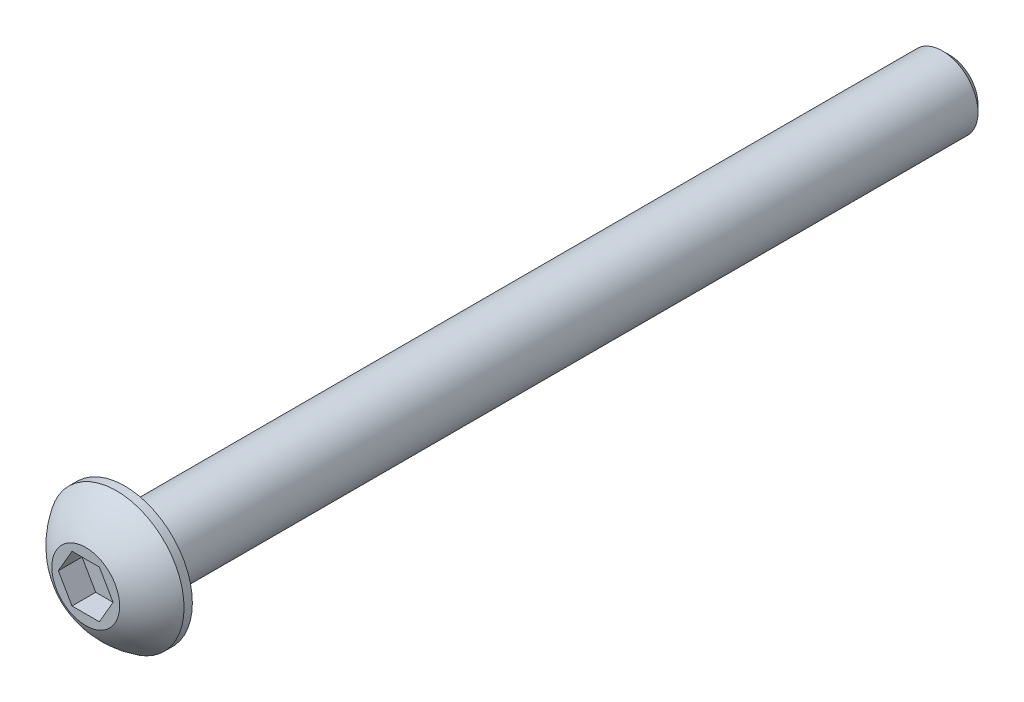
ISO-10303-21;
HEADER;
FILE_DESCRIPTION(('STEP AP214'),'2;1');
FILE_NAME('part.step','',(''),(''),'','','');
FILE_SCHEMA(('AUTOMOTIVE_DESIGN { 1 0 10303 214 1 1 1 1 }'));
ENDSEC;
DATA;
#1=APPLICATION_CONTEXT('core data for automotive mechanical design processes');
#2=APPLICATION_PROTOCOL_DEFINITION('international standard','automotive_design',2000,#1);
#3=PRODUCT_CONTEXT('',#1,'mechanical');
#4=PRODUCT('Part','Part','',(#3));
#5=PRODUCT_RELATED_PRODUCT_CATEGORY('part','',(#4));
#6=PRODUCT_DEFINITION_FORMATION('','',#4);
#7=PRODUCT_DEFINITION_CONTEXT('part definition',#1,'design');
#8=PRODUCT_DEFINITION('design','',#6,#7);
#9=PRODUCT_DEFINITION_SHAPE('','',#8);
#10=(LENGTH_UNIT() NAMED_UNIT(*) SI_UNIT(.MILLI.,.METRE.));
#11=(NAMED_UNIT(*) PLANE_ANGLE_UNIT() SI_UNIT($,.RADIAN.));
#12=(NAMED_UNIT(*) SI_UNIT($,.STERADIAN.) SOLID_ANGLE_UNIT());
#13=UNCERTAINTY_MEASURE_WITH_UNIT(LENGTH_MEASURE(1.E-05),#10,'distance_accuracy_value','');
#14=(GEOMETRIC_REPRESENTATION_CONTEXT(3) GLOBAL_UNCERTAINTY_ASSIGNED_CONTEXT((#13)) GLOBAL_UNIT_ASSIGNED_CONTEXT((#10,
#11,#12)) REPRESENTATION_CONTEXT('',''));
#15=CARTESIAN_POINT('',(0.,0.,0.));
#16=DIRECTION('',(0.,0.,1.));
#17=DIRECTION('',(1.,0.,0.));
#18=AXIS2_PLACEMENT_3D('',#15,#16,#17);
#19=CARTESIAN_POINT('',(0.,0.,-34.8));
#20=DIRECTION('',(0.,0.,1.));
#21=DIRECTION('',(1.,0.,0.));
#22=AXIS2_PLACEMENT_3D('',#19,#20,#21);
#23=PLANE('',#22);
#24=CARTESIAN_POINT('',(0.,0.,-34.8));
#25=DIRECTION('',(0.,0.,1.));
#26=DIRECTION('',(1.,0.,0.));
#27=AXIS2_PLACEMENT_3D('',#24,#25,#26);
#28=CIRCLE('',#27,1.20000000000001);
#29=CARTESIAN_POINT('',(1.20000000000001,0.,-34.8));
#30=VERTEX_POINT('',#29);
#31=EDGE_CURVE('E11',#30,#30,#28,.F.);
#32=ORIENTED_EDGE('',*,*,#31,.T.);
#33=EDGE_LOOP('',(#32));
#34=FACE_BOUND('',#33,.T.);
#35=ADVANCED_FACE('F46',(#34),#23,.F.);
#36=CARTESIAN_POINT('',(0.,0.,1.65));
#37=DIRECTION('',(0.,0.,-1.));
#38=DIRECTION('',(-1.,0.,0.));
#39=AXIS2_PLACEMENT_3D('',#36,#37,#38);
#40=PLANE('',#39);
#41=DIRECTION('',(-0.5,-0.866025403784439,0.));
#42=VECTOR('',#41,1.);
#43=CARTESIAN_POINT('',(-0.577350269189626,1.,1.65));
#44=LINE('',#43,#42);
#45=CARTESIAN_POINT('',(-0.577350269189626,1.,1.65));
#46=VERTEX_POINT('',#45);
#47=CARTESIAN_POINT('',(-1.15470053837925,0.,1.65));
#48=VERTEX_POINT('',#47);
#49=EDGE_CURVE('E136',#46,#48,#44,.T.);
#50=ORIENTED_EDGE('',*,*,#49,.F.);
#51=DIRECTION('',(-1.,0.,0.));
#52=VECTOR('',#51,1.);
#53=CARTESIAN_POINT('',(0.577350269189626,1.,1.65));
#54=LINE('',#53,#52);
#55=CARTESIAN_POINT('',(0.577350269189626,1.,1.65));
#56=VERTEX_POINT('',#55);
#57=EDGE_CURVE('E62',#56,#46,#54,.T.);
#58=ORIENTED_EDGE('',*,*,#57,.F.);
#59=DIRECTION('',(-0.5,0.866025403784438,0.));
#60=VECTOR('',#59,1.);
#61=CARTESIAN_POINT('',(1.15470053837925,0.,1.65));
#62=LINE('',#61,#60);
#63=CARTESIAN_POINT('',(1.15470053837925,0.,1.65));
#64=VERTEX_POINT('',#63);
#65=EDGE_CURVE('E145',#64,#56,#62,.T.);
#66=ORIENTED_EDGE('',*,*,#65,.F.);
#67=DIRECTION('',(0.5,0.866025403784439,0.));
#68=VECTOR('',#67,1.);
#69=CARTESIAN_POINT('',(0.577350269189626,-1.,1.65));
#70=LINE('',#69,#68);
#71=CARTESIAN_POINT('',(0.577350269189626,-1.,1.65));
#72=VERTEX_POINT('',#71);
#73=EDGE_CURVE('E143',#72,#64,#70,.T.);
#74=ORIENTED_EDGE('',*,*,#73,.F.);
#75=DIRECTION('',(1.,0.,0.));
#76=VECTOR('',#75,1.);
#77=CARTESIAN_POINT('',(-0.577350269189625,-1.,1.65));
#78=LINE('',#77,#76);
#79=CARTESIAN_POINT('',(-0.577350269189625,-1.,1.65));
#80=VERTEX_POINT('',#79);
#81=EDGE_CURVE('E110',#80,#72,#78,.T.);
#82=ORIENTED_EDGE('',*,*,#81,.F.);
#83=DIRECTION('',(0.5,-0.866025403784438,0.));
#84=VECTOR('',#83,1.);
#85=CARTESIAN_POINT('',(-1.15470053837925,0.,1.65));
#86=LINE('',#85,#84);
#87=EDGE_CURVE('E139',#48,#80,#86,.T.);
#88=ORIENTED_EDGE('',*,*,#87,.F.);
#89=EDGE_LOOP('',(#50,#58,#66,#74,#82,#88));
#90=FACE_BOUND('',#89,.T.);
#91=CARTESIAN_POINT('',(0.,0.,1.65));
#92=DIRECTION('',(0.,0.,1.));
#93=DIRECTION('',(1.,0.,0.));
#94=AXIS2_PLACEMENT_3D('',#91,#92,#93);
#95=CIRCLE('',#94,1.43);
#96=CARTESIAN_POINT('',(1.43,0.,1.65));
#97=VERTEX_POINT('',#96);
#98=EDGE_CURVE('E163',#97,#97,#95,.T.);
#99=ORIENTED_EDGE('',*,*,#98,.T.);
#100=EDGE_LOOP('',(#99));
#101=FACE_BOUND('',#100,.T.);
#102=ADVANCED_FACE('F180',(#90,#101),#40,.F.);
#103=CARTESIAN_POINT('',(0.,0.,-1.52032985611787));
#104=DIRECTION('',(0.,0.,1.));
#105=DIRECTION('',(1.,0.,0.));
#106=AXIS2_PLACEMENT_3D('',#103,#104,#105);
#107=DEGENERATE_TOROIDAL_SURFACE('',#106,0.167344234474104,3.55,.F.);
#108=ORIENTED_EDGE('',*,*,#98,.F.);
#109=EDGE_LOOP('',(#108));
#110=FACE_BOUND('',#109,.T.);
#111=CARTESIAN_POINT('',(0.,0.,0.35));
#112=DIRECTION('',(0.,0.,1.));
#113=DIRECTION('',(1.,0.,0.));
#114=AXIS2_PLACEMENT_3D('',#111,#112,#113);
#115=CIRCLE('',#114,2.85);
#116=CARTESIAN_POINT('',(2.85,0.,0.35));
#117=VERTEX_POINT('',#116);
#118=EDGE_CURVE('E160',#117,#117,#115,.T.);
#119=ORIENTED_EDGE('',*,*,#118,.T.);
#120=EDGE_LOOP('',(#119));
#121=FACE_BOUND('',#120,.T.);
#122=ADVANCED_FACE('F185',(#110,#121),#107,.F.);
#123=CARTESIAN_POINT('',(0.,0.,0.));
#124=DIRECTION('',(0.,0.,1.));
#125=DIRECTION('',(1.,0.,0.));
#126=AXIS2_PLACEMENT_3D('',#123,#124,#125);
#127=CYLINDRICAL_SURFACE('',#126,2.85);
#128=ORIENTED_EDGE('',*,*,#118,.F.);
#129=EDGE_LOOP('',(#128));
#130=FACE_BOUND('',#129,.T.);
#131=CARTESIAN_POINT('',(0.,0.,0.));
#132=DIRECTION('',(0.,0.,1.));
#133=DIRECTION('',(1.,0.,0.));
#134=AXIS2_PLACEMENT_3D('',#131,#132,#133);
#135=CIRCLE('',#134,2.85);
#136=CARTESIAN_POINT('',(2.85,0.,0.));
#137=VERTEX_POINT('',#136);
#138=EDGE_CURVE('E157',#137,#137,#135,.T.);
#139=ORIENTED_EDGE('',*,*,#138,.T.);
#140=EDGE_LOOP('',(#139));
#141=FACE_BOUND('',#140,.T.);
#142=ADVANCED_FACE('F191',(#130,#141),#127,.T.);
#143=CARTESIAN_POINT('',(0.,1.5,0.));
#144=DIRECTION('',(0.,0.,1.));
#145=DIRECTION('',(1.,0.,0.));
#146=AXIS2_PLACEMENT_3D('',#143,#144,#145);
#147=PLANE('',#146);
#148=ORIENTED_EDGE('',*,*,#138,.F.);
#149=EDGE_LOOP('',(#148));
#150=FACE_BOUND('',#149,.T.);
#151=CARTESIAN_POINT('',(0.,0.,0.));
#152=DIRECTION('',(0.,0.,1.));
#153=DIRECTION('',(1.,0.,0.));
#154=AXIS2_PLACEMENT_3D('',#151,#152,#153);
#155=CIRCLE('',#154,1.5);
#156=CARTESIAN_POINT('',(1.5,0.,0.));
#157=VERTEX_POINT('',#156);
#158=EDGE_CURVE('E149',#157,#157,#155,.T.);
#159=ORIENTED_EDGE('',*,*,#158,.T.);
#160=EDGE_LOOP('',(#159));
#161=FACE_BOUND('',#160,.T.);
#162=ADVANCED_FACE('F195',(#150,#161),#147,.F.);
#163=CARTESIAN_POINT('',(0.,0.,0.));
#164=DIRECTION('',(0.,0.,1.));
#165=DIRECTION('',(1.,0.,0.));
#166=AXIS2_PLACEMENT_3D('',#163,#164,#165);
#167=CYLINDRICAL_SURFACE('',#166,1.5);
#168=CARTESIAN_POINT('',(0.,0.,-34.5));
#169=DIRECTION('',(0.,0.,1.));
#170=DIRECTION('',(1.,0.,0.));
#171=AXIS2_PLACEMENT_3D('',#168,#169,#170);
#172=CIRCLE('',#171,1.5);
#173=CARTESIAN_POINT('',(1.5,0.,-34.5));
#174=VERTEX_POINT('',#173);
#175=EDGE_CURVE('E55',#174,#174,#172,.T.);
#176=ORIENTED_EDGE('',*,*,#175,.T.);
#177=EDGE_LOOP('',(#176));
#178=FACE_BOUND('',#177,.T.);
#179=ORIENTED_EDGE('',*,*,#158,.F.);
#180=EDGE_LOOP('',(#179));
#181=FACE_BOUND('',#180,.T.);
#182=ADVANCED_FACE('F168',(#178,#181),#167,.T.);
#183=CARTESIAN_POINT('',(0.577350269189626,1.,0.65));
#184=DIRECTION('',(0.,1.,0.));
#185=DIRECTION('',(0.,0.,1.));
#186=AXIS2_PLACEMENT_3D('',#183,#184,#185);
#187=PLANE('',#186);
#188=ORIENTED_EDGE('',*,*,#57,.T.);
#189=DIRECTION('',(0.,0.,1.));
#190=VECTOR('',#189,1.);
#191=CARTESIAN_POINT('',(-0.577350269189626,1.,0.65));
#192=LINE('',#191,#190);
#193=CARTESIAN_POINT('',(-0.577350269189626,1.,0.65));
#194=VERTEX_POINT('',#193);
#195=EDGE_CURVE('E92',#194,#46,#192,.T.);
#196=ORIENTED_EDGE('',*,*,#195,.F.);
#197=DIRECTION('',(-1.,0.,0.));
#198=VECTOR('',#197,1.);
#199=CARTESIAN_POINT('',(0.577350269189626,1.,0.65));
#200=LINE('',#199,#198);
#201=CARTESIAN_POINT('',(0.577350269189626,1.,0.65));
#202=VERTEX_POINT('',#201);
#203=EDGE_CURVE('E147',#202,#194,#200,.T.);
#204=ORIENTED_EDGE('',*,*,#203,.F.);
#205=DIRECTION('',(0.,0.,1.));
#206=VECTOR('',#205,1.);
#207=CARTESIAN_POINT('',(0.577350269189626,1.,0.65));
#208=LINE('',#207,#206);
#209=EDGE_CURVE('E70',#202,#56,#208,.T.);
#210=ORIENTED_EDGE('',*,*,#209,.T.);
#211=EDGE_LOOP('',(#188,#196,#204,#210));
#212=FACE_BOUND('',#211,.T.);
#213=ADVANCED_FACE('F202',(#212),#187,.F.);
#214=CARTESIAN_POINT('',(1.15470053837925,0.,0.65));
#215=DIRECTION('',(0.866025403784439,0.5,0.));
#216=DIRECTION('',(-0.5,0.866025403784438,0.));
#217=AXIS2_PLACEMENT_3D('',#214,#215,#216);
#218=PLANE('',#217);
#219=ORIENTED_EDGE('',*,*,#65,.T.);
#220=ORIENTED_EDGE('',*,*,#209,.F.);
#221=DIRECTION('',(-0.5,0.866025403784438,0.));
#222=VECTOR('',#221,1.);
#223=CARTESIAN_POINT('',(1.15470053837925,0.,0.65));
#224=LINE('',#223,#222);
#225=CARTESIAN_POINT('',(1.15470053837925,0.,0.65));
#226=VERTEX_POINT('',#225);
#227=EDGE_CURVE('E122',#226,#202,#224,.T.);
#228=ORIENTED_EDGE('',*,*,#227,.F.);
#229=DIRECTION('',(0.,0.,1.));
#230=VECTOR('',#229,1.);
#231=CARTESIAN_POINT('',(1.15470053837925,0.,0.65));
#232=LINE('',#231,#230);
#233=EDGE_CURVE('E114',#226,#64,#232,.T.);
#234=ORIENTED_EDGE('',*,*,#233,.T.);
#235=EDGE_LOOP('',(#219,#220,#228,#234));
#236=FACE_BOUND('',#235,.T.);
#237=ADVANCED_FACE('F205',(#236),#218,.F.);
#238=CARTESIAN_POINT('',(0.577350269189626,-1.,0.65));
#239=DIRECTION('',(0.866025403784439,-0.5,0.));
#240=DIRECTION('',(0.5,0.866025403784439,0.));
#241=AXIS2_PLACEMENT_3D('',#238,#239,#240);
#242=PLANE('',#241);
#243=ORIENTED_EDGE('',*,*,#73,.T.);
#244=ORIENTED_EDGE('',*,*,#233,.F.);
#245=DIRECTION('',(0.5,0.866025403784439,0.));
#246=VECTOR('',#245,1.);
#247=CARTESIAN_POINT('',(0.577350269189626,-1.,0.65));
#248=LINE('',#247,#246);
#249=CARTESIAN_POINT('',(0.577350269189626,-1.,0.65));
#250=VERTEX_POINT('',#249);
#251=EDGE_CURVE('E118',#250,#226,#248,.T.);
#252=ORIENTED_EDGE('',*,*,#251,.F.);
#253=DIRECTION('',(0.,0.,1.));
#254=VECTOR('',#253,1.);
#255=CARTESIAN_POINT('',(0.577350269189626,-1.,0.65));
#256=LINE('',#255,#254);
#257=EDGE_CURVE('E103',#250,#72,#256,.T.);
#258=ORIENTED_EDGE('',*,*,#257,.T.);
#259=EDGE_LOOP('',(#243,#244,#252,#258));
#260=FACE_BOUND('',#259,.T.);
#261=ADVANCED_FACE('F119',(#260),#242,.F.);
#262=CARTESIAN_POINT('',(-0.577350269189625,-1.,0.65));
#263=DIRECTION('',(0.,-1.,0.));
#264=DIRECTION('',(1.,0.,0.));
#265=AXIS2_PLACEMENT_3D('',#262,#263,#264);
#266=PLANE('',#265);
#267=ORIENTED_EDGE('',*,*,#81,.T.);
#268=ORIENTED_EDGE('',*,*,#257,.F.);
#269=DIRECTION('',(1.,0.,0.));
#270=VECTOR('',#269,1.);
#271=CARTESIAN_POINT('',(-0.577350269189625,-1.,0.65));
#272=LINE('',#271,#270);
#273=CARTESIAN_POINT('',(-0.577350269189625,-1.,0.65));
#274=VERTEX_POINT('',#273);
#275=EDGE_CURVE('E107',#274,#250,#272,.T.);
#276=ORIENTED_EDGE('',*,*,#275,.F.);
#277=DIRECTION('',(0.,0.,1.));
#278=VECTOR('',#277,1.);
#279=CARTESIAN_POINT('',(-0.577350269189625,-1.,0.65));
#280=LINE('',#279,#278);
#281=EDGE_CURVE('E115',#274,#80,#280,.T.);
#282=ORIENTED_EDGE('',*,*,#281,.T.);
#283=EDGE_LOOP('',(#267,#268,#276,#282));
#284=FACE_BOUND('',#283,.T.);
#285=ADVANCED_FACE('F105',(#284),#266,.F.);
#286=CARTESIAN_POINT('',(-1.15470053837925,0.,0.65));
#287=DIRECTION('',(-0.866025403784438,-0.5,0.));
#288=DIRECTION('',(0.5,-0.866025403784438,0.));
#289=AXIS2_PLACEMENT_3D('',#286,#287,#288);
#290=PLANE('',#289);
#291=ORIENTED_EDGE('',*,*,#87,.T.);
#292=ORIENTED_EDGE('',*,*,#281,.F.);
#293=DIRECTION('',(0.5,-0.866025403784438,0.));
#294=VECTOR('',#293,1.);
#295=CARTESIAN_POINT('',(-1.15470053837925,0.,0.65));
#296=LINE('',#295,#294);
#297=CARTESIAN_POINT('',(-1.15470053837925,0.,0.65));
#298=VERTEX_POINT('',#297);
#299=EDGE_CURVE('E128',#298,#274,#296,.T.);
#300=ORIENTED_EDGE('',*,*,#299,.F.);
#301=DIRECTION('',(0.,0.,1.));
#302=VECTOR('',#301,1.);
#303=CARTESIAN_POINT('',(-1.15470053837925,0.,0.65));
#304=LINE('',#303,#302);
#305=EDGE_CURVE('E152',#298,#48,#304,.T.);
#306=ORIENTED_EDGE('',*,*,#305,.T.);
#307=EDGE_LOOP('',(#291,#292,#300,#306));
#308=FACE_BOUND('',#307,.T.);
#309=ADVANCED_FACE('F208',(#308),#290,.F.);
#310=CARTESIAN_POINT('',(-0.577350269189626,1.,0.65));
#311=DIRECTION('',(-0.866025403784439,0.499999999999999,0.));
#312=DIRECTION('',(-0.5,-0.866025403784439,0.));
#313=AXIS2_PLACEMENT_3D('',#310,#311,#312);
#314=PLANE('',#313);
#315=ORIENTED_EDGE('',*,*,#49,.T.);
#316=ORIENTED_EDGE('',*,*,#305,.F.);
#317=DIRECTION('',(-0.5,-0.866025403784439,0.));
#318=VECTOR('',#317,1.);
#319=CARTESIAN_POINT('',(-0.577350269189626,1.,0.65));
#320=LINE('',#319,#318);
#321=EDGE_CURVE('E130',#194,#298,#320,.T.);
#322=ORIENTED_EDGE('',*,*,#321,.F.);
#323=ORIENTED_EDGE('',*,*,#195,.T.);
#324=EDGE_LOOP('',(#315,#316,#322,#323));
#325=FACE_BOUND('',#324,.T.);
#326=ADVANCED_FACE('F176',(#325),#314,.F.);
#327=CARTESIAN_POINT('',(0.,0.,0.65));
#328=DIRECTION('',(0.,0.,1.));
#329=DIRECTION('',(1.,0.,0.));
#330=AXIS2_PLACEMENT_3D('',#327,#328,#329);
#331=PLANE('',#330);
#332=ORIENTED_EDGE('',*,*,#203,.T.);
#333=ORIENTED_EDGE('',*,*,#321,.T.);
#334=ORIENTED_EDGE('',*,*,#299,.T.);
#335=ORIENTED_EDGE('',*,*,#275,.T.);
#336=ORIENTED_EDGE('',*,*,#251,.T.);
#337=ORIENTED_EDGE('',*,*,#227,.T.);
#338=EDGE_LOOP('',(#332,#333,#334,#335,#336,#337));
#339=FACE_BOUND('',#338,.T.);
#340=ADVANCED_FACE('F125',(#339),#331,.T.);
#341=CARTESIAN_POINT('',(0.,0.,-34.5));
#342=DIRECTION('',(0.,0.,1.));
#343=DIRECTION('',(1.,0.,0.));
#344=AXIS2_PLACEMENT_3D('',#341,#342,#343);
#345=CONICAL_SURFACE('',#344,1.5,0.785398163397442);
#346=ORIENTED_EDGE('',*,*,#31,.F.);
#347=EDGE_LOOP('',(#346));
#348=FACE_BOUND('',#347,.T.);
#349=ORIENTED_EDGE('',*,*,#175,.F.);
#350=EDGE_LOOP('',(#349));
#351=FACE_BOUND('',#350,.T.);
#352=ADVANCED_FACE('F49',(#348,#351),#345,.T.);
#353=CLOSED_SHELL('',(#35,#102,#122,#142,#162,#182,#213,#237,#261,#285,#309,#326,#340,#352));
#354=MANIFOLD_SOLID_BREP('B2',#353);
#355=ADVANCED_BREP_SHAPE_REPRESENTATION('',(#18,#354),#14);
#356=SHAPE_DEFINITION_REPRESENTATION(#9,#355);
ENDSEC;
END-ISO-10303-21;
